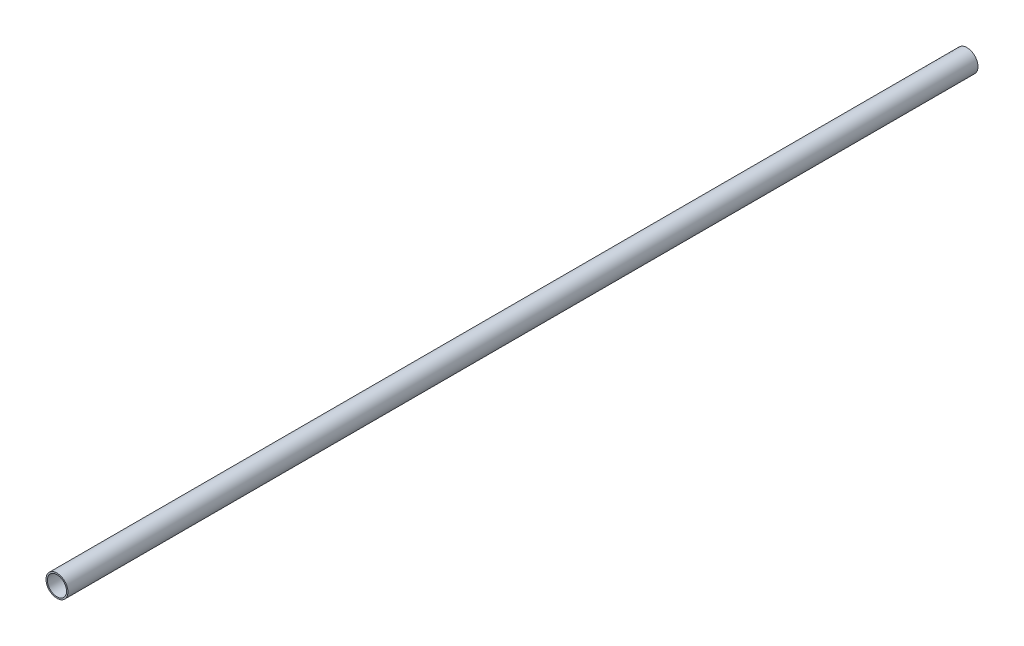
ISO-10303-21;
HEADER;
FILE_DESCRIPTION(('STEP AP214'),'2;1');
FILE_NAME('part.step','',(''),(''),'','','');
FILE_SCHEMA(('AUTOMOTIVE_DESIGN { 1 0 10303 214 1 1 1 1 }'));
ENDSEC;
DATA;
#1=APPLICATION_CONTEXT('core data for automotive mechanical design processes');
#2=APPLICATION_PROTOCOL_DEFINITION('international standard','automotive_design',2000,#1);
#3=PRODUCT_CONTEXT('',#1,'mechanical');
#4=PRODUCT('Part','Part','',(#3));
#5=PRODUCT_RELATED_PRODUCT_CATEGORY('part','',(#4));
#6=PRODUCT_DEFINITION_FORMATION('','',#4);
#7=PRODUCT_DEFINITION_CONTEXT('part definition',#1,'design');
#8=PRODUCT_DEFINITION('design','',#6,#7);
#9=PRODUCT_DEFINITION_SHAPE('','',#8);
#10=(LENGTH_UNIT() NAMED_UNIT(*) SI_UNIT(.MILLI.,.METRE.));
#11=(NAMED_UNIT(*) PLANE_ANGLE_UNIT() SI_UNIT($,.RADIAN.));
#12=(NAMED_UNIT(*) SI_UNIT($,.STERADIAN.) SOLID_ANGLE_UNIT());
#13=UNCERTAINTY_MEASURE_WITH_UNIT(LENGTH_MEASURE(1.E-05),#10,'distance_accuracy_value','');
#14=(GEOMETRIC_REPRESENTATION_CONTEXT(3) GLOBAL_UNCERTAINTY_ASSIGNED_CONTEXT((#13)) GLOBAL_UNIT_ASSIGNED_CONTEXT((#10,
#11,#12)) REPRESENTATION_CONTEXT('',''));
#15=CARTESIAN_POINT('',(0.,0.,0.));
#16=DIRECTION('',(0.,0.,1.));
#17=DIRECTION('',(1.,0.,0.));
#18=AXIS2_PLACEMENT_3D('',#15,#16,#17);
#19=CARTESIAN_POINT('',(2449.7201128805,-5187.00741573402,2000.));
#20=DIRECTION('',(0.,0.,1.));
#21=DIRECTION('',(1.,0.,0.));
#22=AXIS2_PLACEMENT_3D('',#19,#20,#21);
#23=PLANE('',#22);
#24=CARTESIAN_POINT('',(2449.7201128805,-5187.00741573402,2000.));
#25=DIRECTION('',(0.,0.,1.));
#26=DIRECTION('',(1.,0.,0.));
#27=AXIS2_PLACEMENT_3D('',#24,#25,#26);
#28=CIRCLE('',#27,24.125);
#29=CARTESIAN_POINT('',(2473.8451128805,-5187.00741573402,2000.));
#30=VERTEX_POINT('',#29);
#31=EDGE_CURVE('E10',#30,#30,#28,.T.);
#32=ORIENTED_EDGE('',*,*,#31,.T.);
#33=EDGE_LOOP('',(#32));
#34=FACE_BOUND('',#33,.T.);
#35=CARTESIAN_POINT('',(2449.7201128805,-5187.00741573402,2000.));
#36=DIRECTION('',(0.,0.,1.));
#37=DIRECTION('',(1.,0.,0.));
#38=AXIS2_PLACEMENT_3D('',#35,#36,#37);
#39=CIRCLE('',#38,21.0750000000002);
#40=CARTESIAN_POINT('',(2470.7951128805,-5187.00741573402,2000.));
#41=VERTEX_POINT('',#40);
#42=EDGE_CURVE('E43',#41,#41,#39,.T.);
#43=ORIENTED_EDGE('',*,*,#42,.F.);
#44=EDGE_LOOP('',(#43));
#45=FACE_BOUND('',#44,.T.);
#46=ADVANCED_FACE('F32',(#34,#45),#23,.T.);
#47=CARTESIAN_POINT('',(2449.7201128805,-5187.00741573402,0.));
#48=DIRECTION('',(0.,0.,1.));
#49=DIRECTION('',(1.,0.,0.));
#50=AXIS2_PLACEMENT_3D('',#47,#48,#49);
#51=PLANE('',#50);
#52=CARTESIAN_POINT('',(2449.7201128805,-5187.00741573402,0.));
#53=DIRECTION('',(0.,0.,1.));
#54=DIRECTION('',(1.,0.,0.));
#55=AXIS2_PLACEMENT_3D('',#52,#53,#54);
#56=CIRCLE('',#55,24.125);
#57=CARTESIAN_POINT('',(2473.8451128805,-5187.00741573402,0.));
#58=VERTEX_POINT('',#57);
#59=EDGE_CURVE('E36',#58,#58,#56,.T.);
#60=ORIENTED_EDGE('',*,*,#59,.F.);
#61=EDGE_LOOP('',(#60));
#62=FACE_BOUND('',#61,.T.);
#63=CARTESIAN_POINT('',(2449.7201128805,-5187.00741573402,0.));
#64=DIRECTION('',(0.,0.,1.));
#65=DIRECTION('',(1.,0.,0.));
#66=AXIS2_PLACEMENT_3D('',#63,#64,#65);
#67=CIRCLE('',#66,21.0750000000002);
#68=CARTESIAN_POINT('',(2470.7951128805,-5187.00741573402,0.));
#69=VERTEX_POINT('',#68);
#70=EDGE_CURVE('E45',#69,#69,#67,.T.);
#71=ORIENTED_EDGE('',*,*,#70,.T.);
#72=EDGE_LOOP('',(#71));
#73=FACE_BOUND('',#72,.T.);
#74=ADVANCED_FACE('F55',(#62,#73),#51,.F.);
#75=CARTESIAN_POINT('',(2449.7201128805,-5187.00741573402,2000.));
#76=DIRECTION('',(0.,0.,-1.));
#77=DIRECTION('',(-1.,0.,0.));
#78=AXIS2_PLACEMENT_3D('',#75,#76,#77);
#79=CYLINDRICAL_SURFACE('',#78,24.125);
#80=ORIENTED_EDGE('',*,*,#31,.F.);
#81=EDGE_LOOP('',(#80));
#82=FACE_BOUND('',#81,.T.);
#83=ORIENTED_EDGE('',*,*,#59,.T.);
#84=EDGE_LOOP('',(#83));
#85=FACE_BOUND('',#84,.T.);
#86=ADVANCED_FACE('F34',(#82,#85),#79,.T.);
#87=CARTESIAN_POINT('',(2449.7201128805,-5187.00741573402,2000.));
#88=DIRECTION('',(0.,0.,-1.));
#89=DIRECTION('',(-1.,0.,0.));
#90=AXIS2_PLACEMENT_3D('',#87,#88,#89);
#91=CYLINDRICAL_SURFACE('',#90,21.0750000000002);
#92=ORIENTED_EDGE('',*,*,#42,.T.);
#93=EDGE_LOOP('',(#92));
#94=FACE_BOUND('',#93,.T.);
#95=ORIENTED_EDGE('',*,*,#70,.F.);
#96=EDGE_LOOP('',(#95));
#97=FACE_BOUND('',#96,.T.);
#98=ADVANCED_FACE('F51',(#94,#97),#91,.F.);
#99=CLOSED_SHELL('',(#46,#74,#86,#98));
#100=MANIFOLD_SOLID_BREP('B2',#99);
#101=ADVANCED_BREP_SHAPE_REPRESENTATION('',(#18,#100),#14);
#102=SHAPE_DEFINITION_REPRESENTATION(#9,#101);
ENDSEC;
END-ISO-10303-21;
